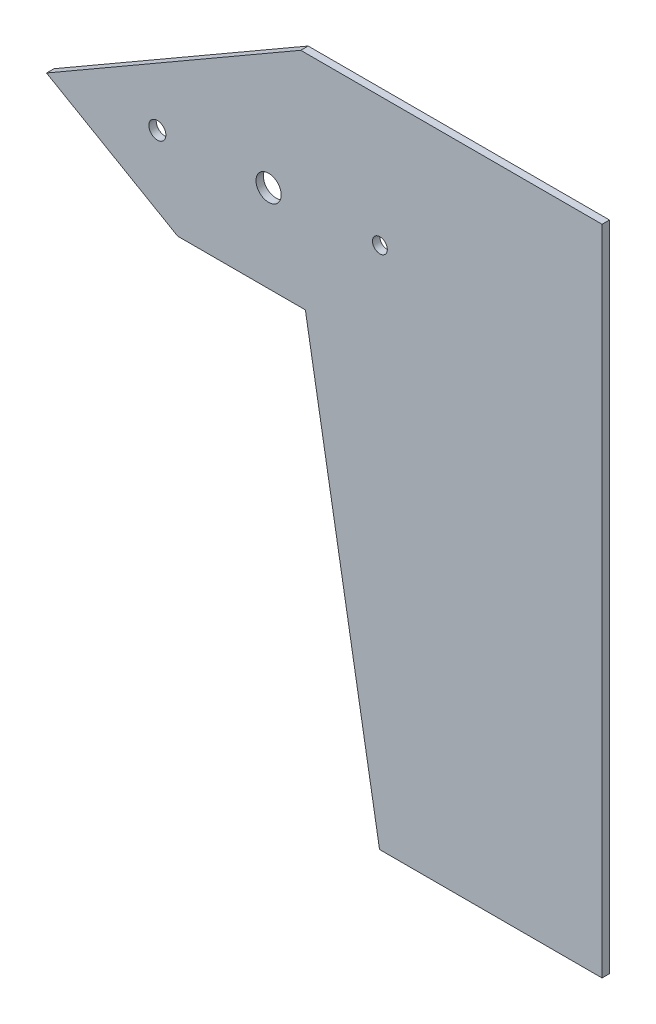
ISO-10303-21;
HEADER;
FILE_DESCRIPTION(('STEP AP214'),'2;1');
FILE_NAME('part.step','',(''),(''),'','','');
FILE_SCHEMA(('AUTOMOTIVE_DESIGN { 1 0 10303 214 1 1 1 1 }'));
ENDSEC;
DATA;
#1=APPLICATION_CONTEXT('core data for automotive mechanical design processes');
#2=APPLICATION_PROTOCOL_DEFINITION('international standard','automotive_design',2000,#1);
#3=PRODUCT_CONTEXT('',#1,'mechanical');
#4=PRODUCT('Part','Part','',(#3));
#5=PRODUCT_RELATED_PRODUCT_CATEGORY('part','',(#4));
#6=PRODUCT_DEFINITION_FORMATION('','',#4);
#7=PRODUCT_DEFINITION_CONTEXT('part definition',#1,'design');
#8=PRODUCT_DEFINITION('design','',#6,#7);
#9=PRODUCT_DEFINITION_SHAPE('','',#8);
#10=(LENGTH_UNIT() NAMED_UNIT(*) SI_UNIT(.MILLI.,.METRE.));
#11=(NAMED_UNIT(*) PLANE_ANGLE_UNIT() SI_UNIT($,.RADIAN.));
#12=(NAMED_UNIT(*) SI_UNIT($,.STERADIAN.) SOLID_ANGLE_UNIT());
#13=UNCERTAINTY_MEASURE_WITH_UNIT(LENGTH_MEASURE(1.E-05),#10,'distance_accuracy_value','');
#14=(GEOMETRIC_REPRESENTATION_CONTEXT(3) GLOBAL_UNCERTAINTY_ASSIGNED_CONTEXT((#13)) GLOBAL_UNIT_ASSIGNED_CONTEXT((#10,
#11,#12)) REPRESENTATION_CONTEXT('',''));
#15=CARTESIAN_POINT('',(0.,0.,0.));
#16=DIRECTION('',(0.,0.,1.));
#17=DIRECTION('',(1.,0.,0.));
#18=AXIS2_PLACEMENT_3D('',#15,#16,#17);
#19=CARTESIAN_POINT('',(124.975757597737,-0.787540701607435,-311.2));
#20=DIRECTION('',(0.500000000000002,0.866025403784438,0.));
#21=DIRECTION('',(-0.866025403784438,0.500000000000002,0.));
#22=AXIS2_PLACEMENT_3D('',#19,#20,#21);
#23=PLANE('',#22);
#24=DIRECTION('',(-0.866025403784438,0.500000000000001,0.));
#25=VECTOR('',#24,1.);
#26=CARTESIAN_POINT('',(124.975757597737,-0.787540701607435,-310.2));
#27=LINE('',#26,#25);
#28=CARTESIAN_POINT('',(142.664255972782,-11.,-310.2));
#29=VERTEX_POINT('',#28);
#30=CARTESIAN_POINT('',(124.975757597737,-0.787540701607435,-310.2));
#31=VERTEX_POINT('',#30);
#32=EDGE_CURVE('E126',#29,#31,#27,.T.);
#33=ORIENTED_EDGE('',*,*,#32,.T.);
#34=DIRECTION('',(0.,0.,1.));
#35=VECTOR('',#34,1.);
#36=CARTESIAN_POINT('',(124.975757597737,-0.787540701607435,-311.2));
#37=LINE('',#36,#35);
#38=CARTESIAN_POINT('',(124.975757597737,-0.787540701607435,-311.2));
#39=VERTEX_POINT('',#38);
#40=EDGE_CURVE('E11',#39,#31,#37,.T.);
#41=ORIENTED_EDGE('',*,*,#40,.F.);
#42=DIRECTION('',(-0.866025403784438,0.500000000000001,0.));
#43=VECTOR('',#42,1.);
#44=CARTESIAN_POINT('',(124.975757597737,-0.787540701607435,-311.2));
#45=LINE('',#44,#43);
#46=CARTESIAN_POINT('',(142.664255972782,-11.,-311.2));
#47=VERTEX_POINT('',#46);
#48=EDGE_CURVE('E140',#47,#39,#45,.T.);
#49=ORIENTED_EDGE('',*,*,#48,.F.);
#50=DIRECTION('',(0.,0.,1.));
#51=VECTOR('',#50,1.);
#52=CARTESIAN_POINT('',(142.664255972782,-11.,-311.2));
#53=LINE('',#52,#51);
#54=EDGE_CURVE('E122',#47,#29,#53,.T.);
#55=ORIENTED_EDGE('',*,*,#54,.T.);
#56=EDGE_LOOP('',(#33,#41,#49,#55));
#57=FACE_BOUND('',#56,.T.);
#58=ADVANCED_FACE('F34',(#57),#23,.F.);
#59=CARTESIAN_POINT('',(124.975757597737,-0.787540701607435,-311.2));
#60=DIRECTION('',(0.500000000000001,-0.866025403784438,0.));
#61=DIRECTION('',(0.866025403784438,0.500000000000001,0.));
#62=AXIS2_PLACEMENT_3D('',#59,#60,#61);
#63=PLANE('',#62);
#64=DIRECTION('',(0.866025403784438,0.500000000000001,0.));
#65=VECTOR('',#64,1.);
#66=CARTESIAN_POINT('',(124.975757597737,-0.787540701607435,-310.2));
#67=LINE('',#66,#65);
#68=CARTESIAN_POINT('',(159.248783449758,19.,-310.2));
#69=VERTEX_POINT('',#68);
#70=EDGE_CURVE('E129',#31,#69,#67,.T.);
#71=ORIENTED_EDGE('',*,*,#70,.T.);
#72=DIRECTION('',(0.,0.,1.));
#73=VECTOR('',#72,1.);
#74=CARTESIAN_POINT('',(159.248783449758,19.,-311.2));
#75=LINE('',#74,#73);
#76=CARTESIAN_POINT('',(159.248783449758,19.,-311.2));
#77=VERTEX_POINT('',#76);
#78=EDGE_CURVE('E43',#77,#69,#75,.T.);
#79=ORIENTED_EDGE('',*,*,#78,.F.);
#80=DIRECTION('',(0.866025403784438,0.500000000000001,0.));
#81=VECTOR('',#80,1.);
#82=CARTESIAN_POINT('',(124.975757597737,-0.787540701607435,-311.2));
#83=LINE('',#82,#81);
#84=EDGE_CURVE('E92',#39,#77,#83,.T.);
#85=ORIENTED_EDGE('',*,*,#84,.F.);
#86=ORIENTED_EDGE('',*,*,#40,.T.);
#87=EDGE_LOOP('',(#71,#79,#85,#86));
#88=FACE_BOUND('',#87,.T.);
#89=ADVANCED_FACE('F195',(#88),#63,.F.);
#90=CARTESIAN_POINT('',(159.248783449758,19.,-311.2));
#91=DIRECTION('',(0.,-1.,0.));
#92=DIRECTION('',(1.,0.,0.));
#93=AXIS2_PLACEMENT_3D('',#90,#91,#92);
#94=PLANE('',#93);
#95=DIRECTION('',(1.,0.,0.));
#96=VECTOR('',#95,1.);
#97=CARTESIAN_POINT('',(159.248783449758,19.,-310.2));
#98=LINE('',#97,#96);
#99=CARTESIAN_POINT('',(199.872932481578,19.,-310.2));
#100=VERTEX_POINT('',#99);
#101=EDGE_CURVE('E132',#69,#100,#98,.T.);
#102=ORIENTED_EDGE('',*,*,#101,.T.);
#103=DIRECTION('',(0.,0.,1.));
#104=VECTOR('',#103,1.);
#105=CARTESIAN_POINT('',(199.872932481578,19.,-311.2));
#106=LINE('',#105,#104);
#107=CARTESIAN_POINT('',(199.872932481578,19.,-311.2));
#108=VERTEX_POINT('',#107);
#109=EDGE_CURVE('E144',#108,#100,#106,.T.);
#110=ORIENTED_EDGE('',*,*,#109,.F.);
#111=DIRECTION('',(1.,0.,0.));
#112=VECTOR('',#111,1.);
#113=CARTESIAN_POINT('',(159.248783449758,19.,-311.2));
#114=LINE('',#113,#112);
#115=EDGE_CURVE('E169',#77,#108,#114,.T.);
#116=ORIENTED_EDGE('',*,*,#115,.F.);
#117=ORIENTED_EDGE('',*,*,#78,.T.);
#118=EDGE_LOOP('',(#102,#110,#116,#117));
#119=FACE_BOUND('',#118,.T.);
#120=ADVANCED_FACE('F173',(#119),#94,.F.);
#121=CARTESIAN_POINT('',(199.872932481578,3.13842343722383,-311.2));
#122=DIRECTION('',(-1.,0.,0.));
#123=DIRECTION('',(0.,0.,1.));
#124=AXIS2_PLACEMENT_3D('',#121,#122,#123);
#125=PLANE('',#124);
#126=DIRECTION('',(0.,-1.,0.));
#127=VECTOR('',#126,1.);
#128=CARTESIAN_POINT('',(199.872932481578,3.13842343722383,-310.2));
#129=LINE('',#128,#127);
#130=CARTESIAN_POINT('',(199.872932481578,-69.,-310.2));
#131=VERTEX_POINT('',#130);
#132=EDGE_CURVE('E135',#100,#131,#129,.T.);
#133=ORIENTED_EDGE('',*,*,#132,.T.);
#134=DIRECTION('',(0.,0.,1.));
#135=VECTOR('',#134,1.);
#136=CARTESIAN_POINT('',(199.872932481578,-69.,-311.2));
#137=LINE('',#136,#135);
#138=CARTESIAN_POINT('',(199.872932481578,-69.,-311.2));
#139=VERTEX_POINT('',#138);
#140=EDGE_CURVE('E117',#139,#131,#137,.T.);
#141=ORIENTED_EDGE('',*,*,#140,.F.);
#142=DIRECTION('',(0.,-1.,0.));
#143=VECTOR('',#142,1.);
#144=CARTESIAN_POINT('',(199.872932481578,19.,-311.2));
#145=LINE('',#144,#143);
#146=EDGE_CURVE('E108',#108,#139,#145,.T.);
#147=ORIENTED_EDGE('',*,*,#146,.F.);
#148=ORIENTED_EDGE('',*,*,#109,.T.);
#149=EDGE_LOOP('',(#133,#141,#147,#148));
#150=FACE_BOUND('',#149,.T.);
#151=ADVANCED_FACE('F176',(#150),#125,.F.);
#152=CARTESIAN_POINT('',(199.872932481578,-69.,-311.2));
#153=DIRECTION('',(0.,1.,0.));
#154=DIRECTION('',(0.,0.,1.));
#155=AXIS2_PLACEMENT_3D('',#152,#153,#154);
#156=PLANE('',#155);
#157=DIRECTION('',(-1.,0.,0.));
#158=VECTOR('',#157,1.);
#159=CARTESIAN_POINT('',(199.872932481578,-69.,-310.2));
#160=LINE('',#159,#158);
#161=CARTESIAN_POINT('',(169.872932481578,-69.,-310.2));
#162=VERTEX_POINT('',#161);
#163=EDGE_CURVE('E116',#131,#162,#160,.T.);
#164=ORIENTED_EDGE('',*,*,#163,.T.);
#165=DIRECTION('',(0.,0.,1.));
#166=VECTOR('',#165,1.);
#167=CARTESIAN_POINT('',(169.872932481578,-69.,-311.2));
#168=LINE('',#167,#166);
#169=CARTESIAN_POINT('',(169.872932481578,-69.,-311.2));
#170=VERTEX_POINT('',#169);
#171=EDGE_CURVE('E113',#170,#162,#168,.T.);
#172=ORIENTED_EDGE('',*,*,#171,.F.);
#173=DIRECTION('',(-1.,0.,0.));
#174=VECTOR('',#173,1.);
#175=CARTESIAN_POINT('',(199.872932481578,-69.,-311.2));
#176=LINE('',#175,#174);
#177=EDGE_CURVE('E102',#139,#170,#176,.T.);
#178=ORIENTED_EDGE('',*,*,#177,.F.);
#179=ORIENTED_EDGE('',*,*,#140,.T.);
#180=EDGE_LOOP('',(#164,#172,#178,#179));
#181=FACE_BOUND('',#180,.T.);
#182=ADVANCED_FACE('F114',(#181),#156,.F.);
#183=CARTESIAN_POINT('',(169.872932481578,-69.,-311.2));
#184=DIRECTION('',(0.985460115744348,0.169906916507646,0.));
#185=DIRECTION('',(-0.169906916507646,0.985460115744348,0.));
#186=AXIS2_PLACEMENT_3D('',#183,#184,#185);
#187=PLANE('',#186);
#188=DIRECTION('',(-0.169906916507646,0.985460115744348,0.));
#189=VECTOR('',#188,1.);
#190=CARTESIAN_POINT('',(169.872932481578,-69.,-310.2));
#191=LINE('',#190,#189);
#192=CARTESIAN_POINT('',(159.872932481578,-11.,-310.2));
#193=VERTEX_POINT('',#192);
#194=EDGE_CURVE('E78',#162,#193,#191,.T.);
#195=ORIENTED_EDGE('',*,*,#194,.T.);
#196=DIRECTION('',(0.,0.,1.));
#197=VECTOR('',#196,1.);
#198=CARTESIAN_POINT('',(159.872932481578,-11.,-311.2));
#199=LINE('',#198,#197);
#200=CARTESIAN_POINT('',(159.872932481578,-11.,-311.2));
#201=VERTEX_POINT('',#200);
#202=EDGE_CURVE('E118',#201,#193,#199,.T.);
#203=ORIENTED_EDGE('',*,*,#202,.F.);
#204=DIRECTION('',(-0.169906916507646,0.985460115744348,0.));
#205=VECTOR('',#204,1.);
#206=CARTESIAN_POINT('',(169.872932481578,-69.,-311.2));
#207=LINE('',#206,#205);
#208=EDGE_CURVE('E106',#170,#201,#207,.T.);
#209=ORIENTED_EDGE('',*,*,#208,.F.);
#210=ORIENTED_EDGE('',*,*,#171,.T.);
#211=EDGE_LOOP('',(#195,#203,#209,#210));
#212=FACE_BOUND('',#211,.T.);
#213=ADVANCED_FACE('F120',(#212),#187,.F.);
#214=CARTESIAN_POINT('',(142.664255972782,-11.,-311.2));
#215=DIRECTION('',(0.,1.,0.));
#216=DIRECTION('',(-1.,0.,0.));
#217=AXIS2_PLACEMENT_3D('',#214,#215,#216);
#218=PLANE('',#217);
#219=DIRECTION('',(-1.,0.,0.));
#220=VECTOR('',#219,1.);
#221=CARTESIAN_POINT('',(142.664255972782,-11.,-310.2));
#222=LINE('',#221,#220);
#223=EDGE_CURVE('E84',#193,#29,#222,.T.);
#224=ORIENTED_EDGE('',*,*,#223,.T.);
#225=ORIENTED_EDGE('',*,*,#54,.F.);
#226=DIRECTION('',(-1.,0.,0.));
#227=VECTOR('',#226,1.);
#228=CARTESIAN_POINT('',(142.664255972782,-11.,-311.2));
#229=LINE('',#228,#227);
#230=EDGE_CURVE('E52',#201,#47,#229,.T.);
#231=ORIENTED_EDGE('',*,*,#230,.F.);
#232=ORIENTED_EDGE('',*,*,#202,.T.);
#233=EDGE_LOOP('',(#224,#225,#231,#232));
#234=FACE_BOUND('',#233,.T.);
#235=ADVANCED_FACE('F183',(#234),#218,.F.);
#236=CARTESIAN_POINT('',(0.,0.,-311.2));
#237=DIRECTION('',(0.,0.,-1.));
#238=DIRECTION('',(-1.,0.,0.));
#239=AXIS2_PLACEMENT_3D('',#236,#237,#238);
#240=PLANE('',#239);
#241=CARTESIAN_POINT('',(154.917835466438,0.781810628505705,-311.2));
#242=DIRECTION('',(0.,0.,-1.));
#243=DIRECTION('',(-1.,0.,0.));
#244=AXIS2_PLACEMENT_3D('',#241,#242,#243);
#245=CIRCLE('',#244,1.70000000000001);
#246=CARTESIAN_POINT('',(153.217835466438,0.781810628505705,-311.2));
#247=VERTEX_POINT('',#246);
#248=EDGE_CURVE('E153',#247,#247,#245,.T.);
#249=ORIENTED_EDGE('',*,*,#248,.F.);
#250=EDGE_LOOP('',(#249));
#251=FACE_BOUND('',#250,.T.);
#252=CARTESIAN_POINT('',(169.917835466438,1.56792731775122,-311.2));
#253=DIRECTION('',(0.,0.,-1.));
#254=DIRECTION('',(-1.,0.,0.));
#255=AXIS2_PLACEMENT_3D('',#252,#253,#254);
#256=CIRCLE('',#255,0.999999999999998);
#257=CARTESIAN_POINT('',(168.917835466438,1.56792731775122,-311.2));
#258=VERTEX_POINT('',#257);
#259=EDGE_CURVE('E158',#258,#258,#256,.T.);
#260=ORIENTED_EDGE('',*,*,#259,.F.);
#261=EDGE_LOOP('',(#260));
#262=FACE_BOUND('',#261,.T.);
#263=CARTESIAN_POINT('',(139.917835466438,-0.00430606073981415,-311.2));
#264=DIRECTION('',(0.,0.,-1.));
#265=DIRECTION('',(-1.,0.,0.));
#266=AXIS2_PLACEMENT_3D('',#263,#264,#265);
#267=CIRCLE('',#266,1.15000000000002);
#268=CARTESIAN_POINT('',(138.767835466438,-0.00430606073981415,-311.2));
#269=VERTEX_POINT('',#268);
#270=EDGE_CURVE('E150',#269,#269,#267,.T.);
#271=ORIENTED_EDGE('',*,*,#270,.F.);
#272=EDGE_LOOP('',(#271));
#273=FACE_BOUND('',#272,.T.);
#274=ORIENTED_EDGE('',*,*,#48,.T.);
#275=ORIENTED_EDGE('',*,*,#84,.T.);
#276=ORIENTED_EDGE('',*,*,#115,.T.);
#277=ORIENTED_EDGE('',*,*,#146,.T.);
#278=ORIENTED_EDGE('',*,*,#177,.T.);
#279=ORIENTED_EDGE('',*,*,#208,.T.);
#280=ORIENTED_EDGE('',*,*,#230,.T.);
#281=EDGE_LOOP('',(#274,#275,#276,#277,#278,#279,#280));
#282=FACE_BOUND('',#281,.T.);
#283=ADVANCED_FACE('F104',(#251,#262,#273,#282),#240,.T.);
#284=CARTESIAN_POINT('',(0.,0.,-310.2));
#285=DIRECTION('',(0.,0.,-1.));
#286=DIRECTION('',(-1.,0.,0.));
#287=AXIS2_PLACEMENT_3D('',#284,#285,#286);
#288=PLANE('',#287);
#289=CARTESIAN_POINT('',(154.917835466438,0.781810628505705,-310.2));
#290=DIRECTION('',(0.,0.,-1.));
#291=DIRECTION('',(-1.,0.,0.));
#292=AXIS2_PLACEMENT_3D('',#289,#290,#291);
#293=CIRCLE('',#292,1.70000000000001);
#294=CARTESIAN_POINT('',(153.217835466438,0.781810628505705,-310.2));
#295=VERTEX_POINT('',#294);
#296=EDGE_CURVE('E37',#295,#295,#293,.F.);
#297=ORIENTED_EDGE('',*,*,#296,.F.);
#298=EDGE_LOOP('',(#297));
#299=FACE_BOUND('',#298,.T.);
#300=CARTESIAN_POINT('',(169.917835466438,1.56792731775122,-310.2));
#301=DIRECTION('',(0.,0.,-1.));
#302=DIRECTION('',(-1.,0.,0.));
#303=AXIS2_PLACEMENT_3D('',#300,#301,#302);
#304=CIRCLE('',#303,0.999999999999998);
#305=CARTESIAN_POINT('',(168.917835466438,1.56792731775122,-310.2));
#306=VERTEX_POINT('',#305);
#307=EDGE_CURVE('E151',#306,#306,#304,.F.);
#308=ORIENTED_EDGE('',*,*,#307,.F.);
#309=EDGE_LOOP('',(#308));
#310=FACE_BOUND('',#309,.T.);
#311=CARTESIAN_POINT('',(139.917835466438,-0.00430606073981415,-310.2));
#312=DIRECTION('',(0.,0.,-1.));
#313=DIRECTION('',(-1.,0.,0.));
#314=AXIS2_PLACEMENT_3D('',#311,#312,#313);
#315=CIRCLE('',#314,1.15000000000002);
#316=CARTESIAN_POINT('',(138.767835466438,-0.00430606073981415,-310.2));
#317=VERTEX_POINT('',#316);
#318=EDGE_CURVE('E130',#317,#317,#315,.F.);
#319=ORIENTED_EDGE('',*,*,#318,.F.);
#320=EDGE_LOOP('',(#319));
#321=FACE_BOUND('',#320,.T.);
#322=ORIENTED_EDGE('',*,*,#32,.F.);
#323=ORIENTED_EDGE('',*,*,#223,.F.);
#324=ORIENTED_EDGE('',*,*,#194,.F.);
#325=ORIENTED_EDGE('',*,*,#163,.F.);
#326=ORIENTED_EDGE('',*,*,#132,.F.);
#327=ORIENTED_EDGE('',*,*,#101,.F.);
#328=ORIENTED_EDGE('',*,*,#70,.F.);
#329=EDGE_LOOP('',(#322,#323,#324,#325,#326,#327,#328));
#330=FACE_BOUND('',#329,.T.);
#331=ADVANCED_FACE('F179',(#299,#310,#321,#330),#288,.F.);
#332=CARTESIAN_POINT('',(139.917835466438,-0.00430606073981415,-311.2));
#333=DIRECTION('',(0.,0.,1.));
#334=DIRECTION('',(1.,0.,0.));
#335=AXIS2_PLACEMENT_3D('',#332,#333,#334);
#336=CYLINDRICAL_SURFACE('',#335,1.15000000000002);
#337=ORIENTED_EDGE('',*,*,#270,.T.);
#338=EDGE_LOOP('',(#337));
#339=FACE_BOUND('',#338,.T.);
#340=ORIENTED_EDGE('',*,*,#318,.T.);
#341=EDGE_LOOP('',(#340));
#342=FACE_BOUND('',#341,.T.);
#343=ADVANCED_FACE('F237',(#339,#342),#336,.F.);
#344=CARTESIAN_POINT('',(169.917835466438,1.56792731775122,-311.2));
#345=DIRECTION('',(0.,0.,1.));
#346=DIRECTION('',(1.,0.,0.));
#347=AXIS2_PLACEMENT_3D('',#344,#345,#346);
#348=CYLINDRICAL_SURFACE('',#347,0.999999999999998);
#349=ORIENTED_EDGE('',*,*,#259,.T.);
#350=EDGE_LOOP('',(#349));
#351=FACE_BOUND('',#350,.T.);
#352=ORIENTED_EDGE('',*,*,#307,.T.);
#353=EDGE_LOOP('',(#352));
#354=FACE_BOUND('',#353,.T.);
#355=ADVANCED_FACE('F246',(#351,#354),#348,.F.);
#356=CARTESIAN_POINT('',(154.917835466438,0.781810628505705,-311.2));
#357=DIRECTION('',(0.,0.,1.));
#358=DIRECTION('',(1.,0.,0.));
#359=AXIS2_PLACEMENT_3D('',#356,#357,#358);
#360=CYLINDRICAL_SURFACE('',#359,1.70000000000001);
#361=ORIENTED_EDGE('',*,*,#248,.T.);
#362=EDGE_LOOP('',(#361));
#363=FACE_BOUND('',#362,.T.);
#364=ORIENTED_EDGE('',*,*,#296,.T.);
#365=EDGE_LOOP('',(#364));
#366=FACE_BOUND('',#365,.T.);
#367=ADVANCED_FACE('F256',(#363,#366),#360,.F.);
#368=CLOSED_SHELL('',(#58,#89,#120,#151,#182,#213,#235,#283,#331,#343,#355,#367));
#369=MANIFOLD_SOLID_BREP('B2',#368);
#370=ADVANCED_BREP_SHAPE_REPRESENTATION('',(#18,#369),#14);
#371=SHAPE_DEFINITION_REPRESENTATION(#9,#370);
ENDSEC;
END-ISO-10303-21;
